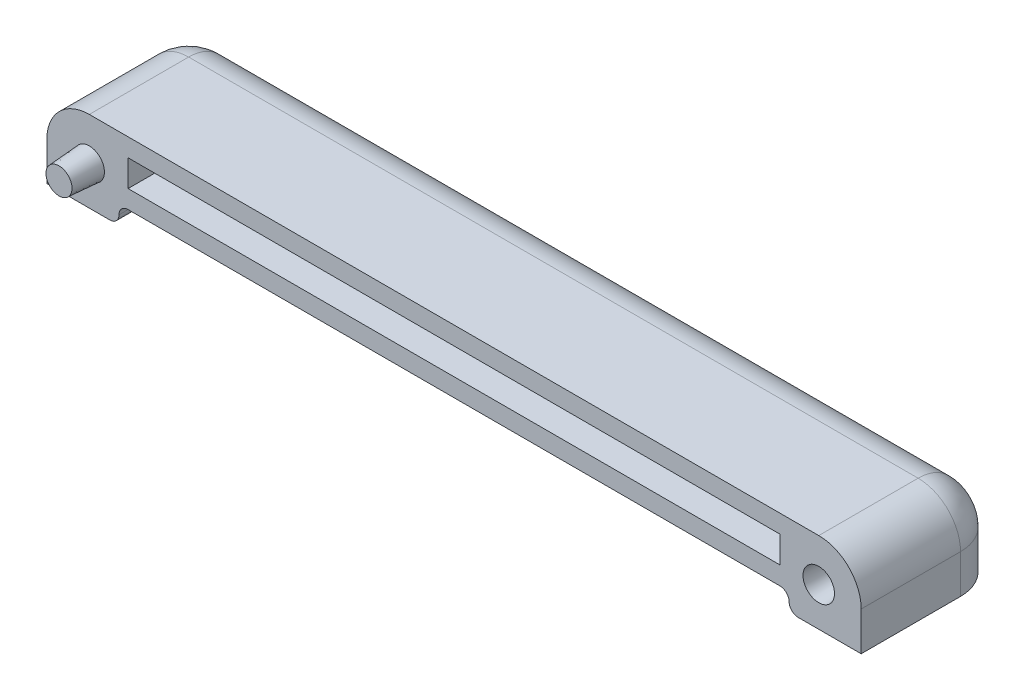
ISO-10303-21;
HEADER;
FILE_DESCRIPTION(('STEP AP214'),'2;1');
FILE_NAME('part.step','',(''),(''),'','','');
FILE_SCHEMA(('AUTOMOTIVE_DESIGN { 1 0 10303 214 1 1 1 1 }'));
ENDSEC;
DATA;
#1=APPLICATION_CONTEXT('core data for automotive mechanical design processes');
#2=APPLICATION_PROTOCOL_DEFINITION('international standard','automotive_design',2000,#1);
#3=PRODUCT_CONTEXT('',#1,'mechanical');
#4=PRODUCT('Part','Part','',(#3));
#5=PRODUCT_RELATED_PRODUCT_CATEGORY('part','',(#4));
#6=PRODUCT_DEFINITION_FORMATION('','',#4);
#7=PRODUCT_DEFINITION_CONTEXT('part definition',#1,'design');
#8=PRODUCT_DEFINITION('design','',#6,#7);
#9=PRODUCT_DEFINITION_SHAPE('','',#8);
#10=(LENGTH_UNIT() NAMED_UNIT(*) SI_UNIT(.MILLI.,.METRE.));
#11=(NAMED_UNIT(*) PLANE_ANGLE_UNIT() SI_UNIT($,.RADIAN.));
#12=(NAMED_UNIT(*) SI_UNIT($,.STERADIAN.) SOLID_ANGLE_UNIT());
#13=UNCERTAINTY_MEASURE_WITH_UNIT(LENGTH_MEASURE(1.E-05),#10,'distance_accuracy_value','');
#14=(GEOMETRIC_REPRESENTATION_CONTEXT(3) GLOBAL_UNCERTAINTY_ASSIGNED_CONTEXT((#13)) GLOBAL_UNIT_ASSIGNED_CONTEXT((#10,
#11,#12)) REPRESENTATION_CONTEXT('',''));
#15=CARTESIAN_POINT('',(0.,0.,0.));
#16=DIRECTION('',(0.,0.,1.));
#17=DIRECTION('',(1.,0.,0.));
#18=AXIS2_PLACEMENT_3D('',#15,#16,#17);
#19=CARTESIAN_POINT('',(0.,0.,3.));
#20=DIRECTION('',(0.,0.,-1.));
#21=DIRECTION('',(-1.,0.,0.));
#22=AXIS2_PLACEMENT_3D('',#19,#20,#21);
#23=PLANE('',#22);
#24=DIRECTION('',(1.,0.,0.));
#25=VECTOR('',#24,1.);
#26=CARTESIAN_POINT('',(67.2,-161.948648405154,3.));
#27=LINE('',#26,#25);
#28=CARTESIAN_POINT('',(-43.6000000000001,-161.948648405154,3.));
#29=VERTEX_POINT('',#28);
#30=CARTESIAN_POINT('',(43.6000000000001,-161.948648405154,3.));
#31=VERTEX_POINT('',#30);
#32=EDGE_CURVE('E309',#29,#31,#27,.T.);
#33=ORIENTED_EDGE('',*,*,#32,.F.);
#34=DIRECTION('',(0.,-1.,0.));
#35=VECTOR('',#34,1.);
#36=CARTESIAN_POINT('',(-43.6000000000001,-161.948648405154,3.));
#37=LINE('',#36,#35);
#38=CARTESIAN_POINT('',(-43.6000000000001,-171.948648405154,3.));
#39=VERTEX_POINT('',#38);
#40=EDGE_CURVE('E314',#29,#39,#37,.T.);
#41=ORIENTED_EDGE('',*,*,#40,.T.);
#42=DIRECTION('',(1.,0.,0.));
#43=VECTOR('',#42,1.);
#44=CARTESIAN_POINT('',(-43.6000000000001,-171.948648405154,3.));
#45=LINE('',#44,#43);
#46=CARTESIAN_POINT('',(43.6000000000001,-171.948648405154,3.));
#47=VERTEX_POINT('',#46);
#48=EDGE_CURVE('E316',#39,#47,#45,.T.);
#49=ORIENTED_EDGE('',*,*,#48,.T.);
#50=DIRECTION('',(0.,1.,0.));
#51=VECTOR('',#50,1.);
#52=CARTESIAN_POINT('',(43.6000000000001,-171.948648405154,3.));
#53=LINE('',#52,#51);
#54=EDGE_CURVE('E319',#47,#31,#53,.T.);
#55=ORIENTED_EDGE('',*,*,#54,.T.);
#56=EDGE_LOOP('',(#33,#41,#49,#55));
#57=FACE_BOUND('',#56,.T.);
#58=ADVANCED_FACE('F46',(#57),#23,.F.);
#59=CARTESIAN_POINT('',(-43.6000000000001,-161.948648405154,3.));
#60=DIRECTION('',(1.,0.,0.));
#61=DIRECTION('',(0.,0.,-1.));
#62=AXIS2_PLACEMENT_3D('',#59,#60,#61);
#63=PLANE('',#62);
#64=DIRECTION('',(0.,-1.,0.));
#65=VECTOR('',#64,1.);
#66=CARTESIAN_POINT('',(-43.6000000000001,-161.948648405154,0.));
#67=LINE('',#66,#65);
#68=CARTESIAN_POINT('',(-43.6000000000001,-161.948648405154,0.));
#69=VERTEX_POINT('',#68);
#70=CARTESIAN_POINT('',(-43.6000000000001,-171.948648405154,0.));
#71=VERTEX_POINT('',#70);
#72=EDGE_CURVE('E323',#69,#71,#67,.T.);
#73=ORIENTED_EDGE('',*,*,#72,.T.);
#74=DIRECTION('',(0.,0.,-1.));
#75=VECTOR('',#74,1.);
#76=CARTESIAN_POINT('',(-43.6000000000001,-171.948648405154,3.));
#77=LINE('',#76,#75);
#78=EDGE_CURVE('E342',#39,#71,#77,.T.);
#79=ORIENTED_EDGE('',*,*,#78,.F.);
#80=ORIENTED_EDGE('',*,*,#40,.F.);
#81=DIRECTION('',(0.,0.,-1.));
#82=VECTOR('',#81,1.);
#83=CARTESIAN_POINT('',(-43.6000000000001,-161.948648405154,3.));
#84=LINE('',#83,#82);
#85=EDGE_CURVE('E313',#29,#69,#84,.T.);
#86=ORIENTED_EDGE('',*,*,#85,.T.);
#87=EDGE_LOOP('',(#73,#79,#80,#86));
#88=FACE_BOUND('',#87,.T.);
#89=ADVANCED_FACE('F438',(#88),#63,.F.);
#90=CARTESIAN_POINT('',(-43.6000000000001,-171.948648405154,3.));
#91=DIRECTION('',(0.,1.,0.));
#92=DIRECTION('',(0.,0.,1.));
#93=AXIS2_PLACEMENT_3D('',#90,#91,#92);
#94=PLANE('',#93);
#95=DIRECTION('',(1.,0.,0.));
#96=VECTOR('',#95,1.);
#97=CARTESIAN_POINT('',(-43.6000000000001,-171.948648405154,0.));
#98=LINE('',#97,#96);
#99=CARTESIAN_POINT('',(43.6000000000001,-171.948648405154,0.));
#100=VERTEX_POINT('',#99);
#101=EDGE_CURVE('E325',#71,#100,#98,.T.);
#102=ORIENTED_EDGE('',*,*,#101,.T.);
#103=DIRECTION('',(0.,0.,-1.));
#104=VECTOR('',#103,1.);
#105=CARTESIAN_POINT('',(43.6000000000001,-171.948648405154,3.));
#106=LINE('',#105,#104);
#107=EDGE_CURVE('E339',#47,#100,#106,.T.);
#108=ORIENTED_EDGE('',*,*,#107,.F.);
#109=ORIENTED_EDGE('',*,*,#48,.F.);
#110=ORIENTED_EDGE('',*,*,#78,.T.);
#111=EDGE_LOOP('',(#102,#108,#109,#110));
#112=FACE_BOUND('',#111,.T.);
#113=ADVANCED_FACE('F444',(#112),#94,.F.);
#114=CARTESIAN_POINT('',(43.6000000000001,-171.948648405154,3.));
#115=DIRECTION('',(-1.,0.,0.));
#116=DIRECTION('',(0.,0.,1.));
#117=AXIS2_PLACEMENT_3D('',#114,#115,#116);
#118=PLANE('',#117);
#119=DIRECTION('',(0.,1.,0.));
#120=VECTOR('',#119,1.);
#121=CARTESIAN_POINT('',(43.6000000000001,-171.948648405154,0.));
#122=LINE('',#121,#120);
#123=CARTESIAN_POINT('',(43.6000000000001,-161.948648405154,0.));
#124=VERTEX_POINT('',#123);
#125=EDGE_CURVE('E327',#100,#124,#122,.T.);
#126=ORIENTED_EDGE('',*,*,#125,.T.);
#127=DIRECTION('',(0.,0.,-1.));
#128=VECTOR('',#127,1.);
#129=CARTESIAN_POINT('',(43.6000000000001,-161.948648405154,3.));
#130=LINE('',#129,#128);
#131=EDGE_CURVE('E336',#31,#124,#130,.T.);
#132=ORIENTED_EDGE('',*,*,#131,.F.);
#133=ORIENTED_EDGE('',*,*,#54,.F.);
#134=ORIENTED_EDGE('',*,*,#107,.T.);
#135=EDGE_LOOP('',(#126,#132,#133,#134));
#136=FACE_BOUND('',#135,.T.);
#137=ADVANCED_FACE('F471',(#136),#118,.F.);
#138=CARTESIAN_POINT('',(43.6000000000001,-161.948648405154,3.));
#139=DIRECTION('',(0.,1.,0.));
#140=DIRECTION('',(0.,0.,1.));
#141=AXIS2_PLACEMENT_3D('',#138,#139,#140);
#142=PLANE('',#141);
#143=CARTESIAN_POINT('',(-48.3000000000006,-161.948648405154,18.9));
#144=DIRECTION('',(0.,1.,0.));
#145=DIRECTION('',(0.,0.,1.));
#146=AXIS2_PLACEMENT_3D('',#143,#144,#145);
#147=CIRCLE('',#146,8.5);
#148=CARTESIAN_POINT('',(-48.3000000000006,-161.948648405154,10.4));
#149=VERTEX_POINT('',#148);
#150=CARTESIAN_POINT('',(-56.8000000000006,-161.948648405154,18.9));
#151=VERTEX_POINT('',#150);
#152=EDGE_CURVE('E394',#149,#151,#147,.T.);
#153=ORIENTED_EDGE('',*,*,#152,.T.);
#154=DIRECTION('',(0.,0.,-1.));
#155=VECTOR('',#154,1.);
#156=CARTESIAN_POINT('',(-56.8000000000006,-161.948648405154,3.));
#157=LINE('',#156,#155);
#158=CARTESIAN_POINT('',(-56.8000000000006,-161.948648405154,23.4));
#159=VERTEX_POINT('',#158);
#160=EDGE_CURVE('E396',#151,#159,#157,.F.);
#161=ORIENTED_EDGE('',*,*,#160,.T.);
#162=DIRECTION('',(1.,0.,0.));
#163=VECTOR('',#162,1.);
#164=CARTESIAN_POINT('',(-67.2,-161.948648405154,23.4));
#165=LINE('',#164,#163);
#166=CARTESIAN_POINT('',(-67.2,-161.948648405154,23.4));
#167=VERTEX_POINT('',#166);
#168=EDGE_CURVE('E305',#167,#159,#165,.T.);
#169=ORIENTED_EDGE('',*,*,#168,.F.);
#170=DIRECTION('',(0.,0.,-1.));
#171=VECTOR('',#170,1.);
#172=CARTESIAN_POINT('',(-67.2,-161.948648405154,3.));
#173=LINE('',#172,#171);
#174=CARTESIAN_POINT('',(-67.2,-161.948648405154,7.));
#175=VERTEX_POINT('',#174);
#176=EDGE_CURVE('E321',#167,#175,#173,.T.);
#177=ORIENTED_EDGE('',*,*,#176,.T.);
#178=CARTESIAN_POINT('',(-60.2,-161.948648405154,7.));
#179=DIRECTION('',(0.,1.,0.));
#180=DIRECTION('',(0.,0.,1.));
#181=AXIS2_PLACEMENT_3D('',#178,#179,#180);
#182=CIRCLE('',#181,7.);
#183=CARTESIAN_POINT('',(-60.2,-161.948648405154,0.));
#184=VERTEX_POINT('',#183);
#185=EDGE_CURVE('E363',#175,#184,#182,.F.);
#186=ORIENTED_EDGE('',*,*,#185,.T.);
#187=DIRECTION('',(1.,0.,0.));
#188=VECTOR('',#187,1.);
#189=CARTESIAN_POINT('',(-67.2,-161.948648405154,0.));
#190=LINE('',#189,#188);
#191=EDGE_CURVE('E308',#184,#69,#190,.T.);
#192=ORIENTED_EDGE('',*,*,#191,.T.);
#193=ORIENTED_EDGE('',*,*,#85,.F.);
#194=ORIENTED_EDGE('',*,*,#32,.T.);
#195=ORIENTED_EDGE('',*,*,#131,.T.);
#196=DIRECTION('',(1.,0.,0.));
#197=VECTOR('',#196,1.);
#198=CARTESIAN_POINT('',(43.6000000000001,-161.948648405154,0.));
#199=LINE('',#198,#197);
#200=CARTESIAN_POINT('',(60.2,-161.948648405154,0.));
#201=VERTEX_POINT('',#200);
#202=EDGE_CURVE('E317',#124,#201,#199,.T.);
#203=ORIENTED_EDGE('',*,*,#202,.T.);
#204=CARTESIAN_POINT('',(60.2,-161.948648405154,7.));
#205=DIRECTION('',(0.,1.,0.));
#206=DIRECTION('',(0.,0.,1.));
#207=AXIS2_PLACEMENT_3D('',#204,#205,#206);
#208=CIRCLE('',#207,7.);
#209=CARTESIAN_POINT('',(67.2,-161.948648405154,7.));
#210=VERTEX_POINT('',#209);
#211=EDGE_CURVE('E365',#201,#210,#208,.F.);
#212=ORIENTED_EDGE('',*,*,#211,.T.);
#213=DIRECTION('',(0.,0.,-1.));
#214=VECTOR('',#213,1.);
#215=CARTESIAN_POINT('',(67.2,-161.948648405154,3.));
#216=LINE('',#215,#214);
#217=CARTESIAN_POINT('',(67.2,-161.948648405154,23.4));
#218=VERTEX_POINT('',#217);
#219=EDGE_CURVE('E333',#218,#210,#216,.T.);
#220=ORIENTED_EDGE('',*,*,#219,.F.);
#221=CARTESIAN_POINT('',(56.8000000000006,-161.948648405154,23.4));
#222=VERTEX_POINT('',#221);
#223=EDGE_CURVE('E304',#222,#218,#165,.T.);
#224=ORIENTED_EDGE('',*,*,#223,.F.);
#225=DIRECTION('',(0.,0.,1.));
#226=VECTOR('',#225,1.);
#227=CARTESIAN_POINT('',(56.8000000000005,-161.948648405154,2.99999999999998));
#228=LINE('',#227,#226);
#229=CARTESIAN_POINT('',(56.8000000000006,-161.948648405154,18.9));
#230=VERTEX_POINT('',#229);
#231=EDGE_CURVE('E392',#222,#230,#228,.F.);
#232=ORIENTED_EDGE('',*,*,#231,.T.);
#233=CARTESIAN_POINT('',(48.3000000000006,-161.948648405154,18.9));
#234=DIRECTION('',(0.,1.,0.));
#235=DIRECTION('',(0.,0.,1.));
#236=AXIS2_PLACEMENT_3D('',#233,#234,#235);
#237=CIRCLE('',#236,8.5);
#238=CARTESIAN_POINT('',(48.3000000000006,-161.948648405154,10.4));
#239=VERTEX_POINT('',#238);
#240=EDGE_CURVE('E390',#230,#239,#237,.T.);
#241=ORIENTED_EDGE('',*,*,#240,.T.);
#242=DIRECTION('',(1.,0.,0.));
#243=VECTOR('',#242,1.);
#244=CARTESIAN_POINT('',(43.6000000000001,-161.948648405154,10.4));
#245=LINE('',#244,#243);
#246=EDGE_CURVE('E374',#239,#149,#245,.F.);
#247=ORIENTED_EDGE('',*,*,#246,.T.);
#248=EDGE_LOOP('',(#153,#161,#169,#177,#186,#192,#193,#194,#195,#203,#212,#220,#224,#232,#241,#247));
#249=FACE_BOUND('',#248,.T.);
#250=ADVANCED_FACE('F467',(#249),#142,.F.);
#251=CARTESIAN_POINT('',(67.2,-161.948648405154,3.));
#252=DIRECTION('',(-1.,0.,0.));
#253=DIRECTION('',(0.,-1.,0.));
#254=AXIS2_PLACEMENT_3D('',#251,#252,#253);
#255=PLANE('',#254);
#256=ORIENTED_EDGE('',*,*,#219,.T.);
#257=DIRECTION('',(0.,1.,0.));
#258=VECTOR('',#257,1.);
#259=CARTESIAN_POINT('',(67.2,-148.548648405155,7.));
#260=LINE('',#259,#258);
#261=CARTESIAN_POINT('',(67.2,-155.548648405154,7.));
#262=VERTEX_POINT('',#261);
#263=EDGE_CURVE('E361',#210,#262,#260,.T.);
#264=ORIENTED_EDGE('',*,*,#263,.T.);
#265=DIRECTION('',(0.,0.,-1.));
#266=VECTOR('',#265,1.);
#267=CARTESIAN_POINT('',(67.2,-155.548648405154,3.));
#268=LINE('',#267,#266);
#269=CARTESIAN_POINT('',(67.2,-155.548648405154,23.4));
#270=VERTEX_POINT('',#269);
#271=EDGE_CURVE('E359',#262,#270,#268,.F.);
#272=ORIENTED_EDGE('',*,*,#271,.T.);
#273=DIRECTION('',(0.,1.,0.));
#274=VECTOR('',#273,1.);
#275=CARTESIAN_POINT('',(67.2,-161.948648405154,23.4));
#276=LINE('',#275,#274);
#277=EDGE_CURVE('E296',#218,#270,#276,.T.);
#278=ORIENTED_EDGE('',*,*,#277,.F.);
#279=EDGE_LOOP('',(#256,#264,#272,#278));
#280=FACE_BOUND('',#279,.T.);
#281=ADVANCED_FACE('F463',(#280),#255,.F.);
#282=CARTESIAN_POINT('',(67.2,-148.548648405155,3.));
#283=DIRECTION('',(0.,-1.,0.));
#284=DIRECTION('',(1.,0.,0.));
#285=AXIS2_PLACEMENT_3D('',#282,#283,#284);
#286=PLANE('',#285);
#287=DIRECTION('',(-1.,0.,0.));
#288=VECTOR('',#287,1.);
#289=CARTESIAN_POINT('',(67.2,-148.548648405155,23.4));
#290=LINE('',#289,#288);
#291=CARTESIAN_POINT('',(60.2,-148.548648405155,23.4));
#292=VERTEX_POINT('',#291);
#293=CARTESIAN_POINT('',(-60.2,-148.548648405155,23.4));
#294=VERTEX_POINT('',#293);
#295=EDGE_CURVE('E299',#292,#294,#290,.T.);
#296=ORIENTED_EDGE('',*,*,#295,.F.);
#297=DIRECTION('',(0.,0.,-1.));
#298=VECTOR('',#297,1.);
#299=CARTESIAN_POINT('',(60.2,-148.548648405155,3.));
#300=LINE('',#299,#298);
#301=CARTESIAN_POINT('',(60.2,-148.548648405155,7.));
#302=VERTEX_POINT('',#301);
#303=EDGE_CURVE('E351',#292,#302,#300,.T.);
#304=ORIENTED_EDGE('',*,*,#303,.T.);
#305=DIRECTION('',(-1.,0.,0.));
#306=VECTOR('',#305,1.);
#307=CARTESIAN_POINT('',(-67.2,-148.548648405155,7.));
#308=LINE('',#307,#306);
#309=CARTESIAN_POINT('',(-60.2,-148.548648405155,7.));
#310=VERTEX_POINT('',#309);
#311=EDGE_CURVE('E348',#302,#310,#308,.T.);
#312=ORIENTED_EDGE('',*,*,#311,.T.);
#313=DIRECTION('',(0.,0.,-1.));
#314=VECTOR('',#313,1.);
#315=CARTESIAN_POINT('',(-60.2,-148.548648405155,3.));
#316=LINE('',#315,#314);
#317=EDGE_CURVE('E312',#310,#294,#316,.F.);
#318=ORIENTED_EDGE('',*,*,#317,.T.);
#319=EDGE_LOOP('',(#296,#304,#312,#318));
#320=FACE_BOUND('',#319,.T.);
#321=ADVANCED_FACE('F459',(#320),#286,.F.);
#322=CARTESIAN_POINT('',(-67.2,-148.548648405155,3.));
#323=DIRECTION('',(1.,0.,0.));
#324=DIRECTION('',(0.,1.,0.));
#325=AXIS2_PLACEMENT_3D('',#322,#323,#324);
#326=PLANE('',#325);
#327=DIRECTION('',(0.,0.,-1.));
#328=VECTOR('',#327,1.);
#329=CARTESIAN_POINT('',(-67.2,-155.548648405155,3.));
#330=LINE('',#329,#328);
#331=CARTESIAN_POINT('',(-67.2,-155.548648405155,23.4));
#332=VERTEX_POINT('',#331);
#333=CARTESIAN_POINT('',(-67.2,-155.548648405155,7.));
#334=VERTEX_POINT('',#333);
#335=EDGE_CURVE('E371',#332,#334,#330,.T.);
#336=ORIENTED_EDGE('',*,*,#335,.T.);
#337=DIRECTION('',(0.,-1.,0.));
#338=VECTOR('',#337,1.);
#339=CARTESIAN_POINT('',(-67.2,-161.948648405154,7.));
#340=LINE('',#339,#338);
#341=EDGE_CURVE('E373',#334,#175,#340,.T.);
#342=ORIENTED_EDGE('',*,*,#341,.T.);
#343=ORIENTED_EDGE('',*,*,#176,.F.);
#344=DIRECTION('',(0.,-1.,0.));
#345=VECTOR('',#344,1.);
#346=CARTESIAN_POINT('',(-67.2,-148.548648405155,23.4));
#347=LINE('',#346,#345);
#348=EDGE_CURVE('E302',#332,#167,#347,.T.);
#349=ORIENTED_EDGE('',*,*,#348,.F.);
#350=EDGE_LOOP('',(#336,#342,#343,#349));
#351=FACE_BOUND('',#350,.T.);
#352=ADVANCED_FACE('F455',(#351),#326,.F.);
#353=CARTESIAN_POINT('',(0.,0.,0.));
#354=DIRECTION('',(0.,0.,-1.));
#355=DIRECTION('',(-1.,0.,0.));
#356=AXIS2_PLACEMENT_3D('',#353,#354,#355);
#357=PLANE('',#356);
#358=DIRECTION('',(-1.,0.,0.));
#359=VECTOR('',#358,1.);
#360=CARTESIAN_POINT('',(67.2,-155.548648405155,0.));
#361=LINE('',#360,#359);
#362=CARTESIAN_POINT('',(-60.2,-155.548648405155,0.));
#363=VERTEX_POINT('',#362);
#364=CARTESIAN_POINT('',(60.2,-155.548648405155,0.));
#365=VERTEX_POINT('',#364);
#366=EDGE_CURVE('E355',#363,#365,#361,.F.);
#367=ORIENTED_EDGE('',*,*,#366,.T.);
#368=DIRECTION('',(0.,1.,0.));
#369=VECTOR('',#368,1.);
#370=CARTESIAN_POINT('',(60.2,-161.948648405154,0.));
#371=LINE('',#370,#369);
#372=EDGE_CURVE('E357',#365,#201,#371,.F.);
#373=ORIENTED_EDGE('',*,*,#372,.T.);
#374=ORIENTED_EDGE('',*,*,#202,.F.);
#375=ORIENTED_EDGE('',*,*,#125,.F.);
#376=ORIENTED_EDGE('',*,*,#101,.F.);
#377=ORIENTED_EDGE('',*,*,#72,.F.);
#378=ORIENTED_EDGE('',*,*,#191,.F.);
#379=DIRECTION('',(0.,-1.,0.));
#380=VECTOR('',#379,1.);
#381=CARTESIAN_POINT('',(-60.2,-148.548648405155,0.));
#382=LINE('',#381,#380);
#383=EDGE_CURVE('E353',#184,#363,#382,.F.);
#384=ORIENTED_EDGE('',*,*,#383,.T.);
#385=EDGE_LOOP('',(#367,#373,#374,#375,#376,#377,#378,#384));
#386=FACE_BOUND('',#385,.T.);
#387=ADVANCED_FACE('F451',(#386),#357,.T.);
#388=CARTESIAN_POINT('',(0.,0.,23.4));
#389=DIRECTION('',(0.,0.,1.));
#390=DIRECTION('',(1.,0.,0.));
#391=AXIS2_PLACEMENT_3D('',#388,#389,#390);
#392=PLANE('',#391);
#393=CARTESIAN_POINT('',(60.2,-155.548648405155,23.4));
#394=DIRECTION('',(0.,0.,1.));
#395=DIRECTION('',(1.,0.,0.));
#396=AXIS2_PLACEMENT_3D('',#393,#394,#395);
#397=CIRCLE('',#396,2.59999999999999);
#398=CARTESIAN_POINT('',(62.8,-155.548648405155,23.4));
#399=VERTEX_POINT('',#398);
#400=EDGE_CURVE('E822',#399,#399,#397,.T.);
#401=ORIENTED_EDGE('',*,*,#400,.F.);
#402=EDGE_LOOP('',(#401));
#403=FACE_BOUND('',#402,.T.);
#404=CARTESIAN_POINT('',(-60.2,-155.548648405155,23.4));
#405=DIRECTION('',(0.,0.,1.));
#406=DIRECTION('',(1.,0.,0.));
#407=AXIS2_PLACEMENT_3D('',#404,#405,#406);
#408=CIRCLE('',#407,2.5);
#409=CARTESIAN_POINT('',(-57.7,-155.548648405155,23.4));
#410=VERTEX_POINT('',#409);
#411=EDGE_CURVE('E13',#410,#410,#408,.T.);
#412=ORIENTED_EDGE('',*,*,#411,.F.);
#413=EDGE_LOOP('',(#412));
#414=FACE_BOUND('',#413,.T.);
#415=ORIENTED_EDGE('',*,*,#168,.T.);
#416=CARTESIAN_POINT('',(-56.8000000000006,-160.448648405154,23.4));
#417=DIRECTION('',(0.,0.,1.));
#418=DIRECTION('',(1.,0.,0.));
#419=AXIS2_PLACEMENT_3D('',#416,#417,#418);
#420=CIRCLE('',#419,1.5);
#421=CARTESIAN_POINT('',(-55.3000000000006,-160.448648405154,23.4));
#422=VERTEX_POINT('',#421);
#423=EDGE_CURVE('E401',#159,#422,#420,.T.);
#424=ORIENTED_EDGE('',*,*,#423,.T.);
#425=CARTESIAN_POINT('',(-53.8000000000006,-160.448648405154,23.4));
#426=DIRECTION('',(0.,0.,1.));
#427=DIRECTION('',(1.,0.,0.));
#428=AXIS2_PLACEMENT_3D('',#425,#426,#427);
#429=CIRCLE('',#428,1.5);
#430=CARTESIAN_POINT('',(-53.8000000000006,-158.948648405154,23.4));
#431=VERTEX_POINT('',#430);
#432=EDGE_CURVE('E56',#422,#431,#429,.F.);
#433=ORIENTED_EDGE('',*,*,#432,.T.);
#434=DIRECTION('',(-1.,0.,0.));
#435=VECTOR('',#434,1.);
#436=CARTESIAN_POINT('',(-55.3000000000006,-158.948648405154,23.4));
#437=LINE('',#436,#435);
#438=CARTESIAN_POINT('',(53.8000000000006,-158.948648405154,23.4));
#439=VERTEX_POINT('',#438);
#440=EDGE_CURVE('E257',#439,#431,#437,.T.);
#441=ORIENTED_EDGE('',*,*,#440,.F.);
#442=CARTESIAN_POINT('',(53.8000000000006,-160.448648405154,23.4));
#443=DIRECTION('',(0.,0.,1.));
#444=DIRECTION('',(1.,0.,0.));
#445=AXIS2_PLACEMENT_3D('',#442,#443,#444);
#446=CIRCLE('',#445,1.5);
#447=CARTESIAN_POINT('',(55.3000000000006,-160.448648405154,23.4));
#448=VERTEX_POINT('',#447);
#449=EDGE_CURVE('E407',#439,#448,#446,.F.);
#450=ORIENTED_EDGE('',*,*,#449,.T.);
#451=CARTESIAN_POINT('',(56.8000000000006,-160.448648405154,23.4));
#452=DIRECTION('',(0.,0.,1.));
#453=DIRECTION('',(1.,0.,0.));
#454=AXIS2_PLACEMENT_3D('',#451,#452,#453);
#455=CIRCLE('',#454,1.5);
#456=EDGE_CURVE('E399',#448,#222,#455,.T.);
#457=ORIENTED_EDGE('',*,*,#456,.T.);
#458=ORIENTED_EDGE('',*,*,#223,.T.);
#459=ORIENTED_EDGE('',*,*,#277,.T.);
#460=CARTESIAN_POINT('',(60.2,-155.548648405155,23.4));
#461=DIRECTION('',(0.,0.,1.));
#462=DIRECTION('',(1.,0.,0.));
#463=AXIS2_PLACEMENT_3D('',#460,#461,#462);
#464=CIRCLE('',#463,7.);
#465=EDGE_CURVE('E369',#270,#292,#464,.T.);
#466=ORIENTED_EDGE('',*,*,#465,.T.);
#467=ORIENTED_EDGE('',*,*,#295,.T.);
#468=CARTESIAN_POINT('',(-60.2,-155.548648405155,23.4));
#469=DIRECTION('',(0.,0.,1.));
#470=DIRECTION('',(1.,0.,0.));
#471=AXIS2_PLACEMENT_3D('',#468,#469,#470);
#472=CIRCLE('',#471,7.);
#473=EDGE_CURVE('E367',#294,#332,#472,.T.);
#474=ORIENTED_EDGE('',*,*,#473,.T.);
#475=ORIENTED_EDGE('',*,*,#348,.T.);
#476=EDGE_LOOP('',(#415,#424,#433,#441,#450,#457,#458,#459,#466,#467,#474,#475));
#477=FACE_BOUND('',#476,.T.);
#478=DIRECTION('',(-1.,0.,0.));
#479=VECTOR('',#478,1.);
#480=CARTESIAN_POINT('',(-53.8,-151.548648405154,23.4));
#481=LINE('',#480,#479);
#482=CARTESIAN_POINT('',(53.8,-151.548648405154,23.4));
#483=VERTEX_POINT('',#482);
#484=CARTESIAN_POINT('',(-53.8,-151.548648405154,23.4));
#485=VERTEX_POINT('',#484);
#486=EDGE_CURVE('E268',#483,#485,#481,.T.);
#487=ORIENTED_EDGE('',*,*,#486,.F.);
#488=DIRECTION('',(0.,1.,0.));
#489=VECTOR('',#488,1.);
#490=CARTESIAN_POINT('',(53.7999999999999,-155.948648405154,23.4));
#491=LINE('',#490,#489);
#492=CARTESIAN_POINT('',(53.7999999999999,-155.948648405154,23.4));
#493=VERTEX_POINT('',#492);
#494=EDGE_CURVE('E266',#493,#483,#491,.T.);
#495=ORIENTED_EDGE('',*,*,#494,.F.);
#496=DIRECTION('',(1.,0.,0.));
#497=VECTOR('',#496,1.);
#498=CARTESIAN_POINT('',(53.7999999999999,-155.948648405154,23.4));
#499=LINE('',#498,#497);
#500=CARTESIAN_POINT('',(-53.8,-155.948648405154,23.4));
#501=VERTEX_POINT('',#500);
#502=EDGE_CURVE('E275',#501,#493,#499,.T.);
#503=ORIENTED_EDGE('',*,*,#502,.F.);
#504=DIRECTION('',(0.,-1.,0.));
#505=VECTOR('',#504,1.);
#506=CARTESIAN_POINT('',(-53.8,-155.948648405154,23.4));
#507=LINE('',#506,#505);
#508=EDGE_CURVE('E272',#485,#501,#507,.T.);
#509=ORIENTED_EDGE('',*,*,#508,.F.);
#510=EDGE_LOOP('',(#487,#495,#503,#509));
#511=FACE_BOUND('',#510,.T.);
#512=ADVANCED_FACE('F454',(#403,#414,#477,#511),#392,.T.);
#513=CARTESIAN_POINT('',(53.7999999999999,-155.948648405154,23.4));
#514=DIRECTION('',(-1.,0.,0.));
#515=DIRECTION('',(0.,-1.,0.));
#516=AXIS2_PLACEMENT_3D('',#513,#514,#515);
#517=PLANE('',#516);
#518=DIRECTION('',(0.,1.,0.));
#519=VECTOR('',#518,1.);
#520=CARTESIAN_POINT('',(53.7999999999999,-155.948648405154,10.4));
#521=LINE('',#520,#519);
#522=CARTESIAN_POINT('',(53.7999999999999,-155.948648405154,10.4));
#523=VERTEX_POINT('',#522);
#524=CARTESIAN_POINT('',(53.8,-151.548648405154,10.4));
#525=VERTEX_POINT('',#524);
#526=EDGE_CURVE('E279',#523,#525,#521,.T.);
#527=ORIENTED_EDGE('',*,*,#526,.F.);
#528=DIRECTION('',(0.,0.,-1.));
#529=VECTOR('',#528,1.);
#530=CARTESIAN_POINT('',(53.7999999999999,-155.948648405154,23.4));
#531=LINE('',#530,#529);
#532=EDGE_CURVE('E278',#493,#523,#531,.T.);
#533=ORIENTED_EDGE('',*,*,#532,.F.);
#534=ORIENTED_EDGE('',*,*,#494,.T.);
#535=DIRECTION('',(0.,0.,-1.));
#536=VECTOR('',#535,1.);
#537=CARTESIAN_POINT('',(53.8,-151.548648405154,23.4));
#538=LINE('',#537,#536);
#539=EDGE_CURVE('E293',#483,#525,#538,.T.);
#540=ORIENTED_EDGE('',*,*,#539,.T.);
#541=EDGE_LOOP('',(#527,#533,#534,#540));
#542=FACE_BOUND('',#541,.T.);
#543=ADVANCED_FACE('F694',(#542),#517,.T.);
#544=CARTESIAN_POINT('',(-53.8,-151.548648405154,23.4));
#545=DIRECTION('',(0.,-1.,0.));
#546=DIRECTION('',(1.,0.,0.));
#547=AXIS2_PLACEMENT_3D('',#544,#545,#546);
#548=PLANE('',#547);
#549=DIRECTION('',(-1.,0.,0.));
#550=VECTOR('',#549,1.);
#551=CARTESIAN_POINT('',(-53.8,-151.548648405154,10.4));
#552=LINE('',#551,#550);
#553=CARTESIAN_POINT('',(-53.8,-151.548648405154,10.4));
#554=VERTEX_POINT('',#553);
#555=EDGE_CURVE('E281',#525,#554,#552,.T.);
#556=ORIENTED_EDGE('',*,*,#555,.F.);
#557=ORIENTED_EDGE('',*,*,#539,.F.);
#558=ORIENTED_EDGE('',*,*,#486,.T.);
#559=DIRECTION('',(0.,0.,-1.));
#560=VECTOR('',#559,1.);
#561=CARTESIAN_POINT('',(-53.8,-151.548648405154,23.4));
#562=LINE('',#561,#560);
#563=EDGE_CURVE('E290',#485,#554,#562,.T.);
#564=ORIENTED_EDGE('',*,*,#563,.T.);
#565=EDGE_LOOP('',(#556,#557,#558,#564));
#566=FACE_BOUND('',#565,.T.);
#567=ADVANCED_FACE('F685',(#566),#548,.T.);
#568=CARTESIAN_POINT('',(-53.8,-155.948648405154,23.4));
#569=DIRECTION('',(1.,0.,0.));
#570=DIRECTION('',(0.,0.,-1.));
#571=AXIS2_PLACEMENT_3D('',#568,#569,#570);
#572=PLANE('',#571);
#573=DIRECTION('',(0.,-1.,0.));
#574=VECTOR('',#573,1.);
#575=CARTESIAN_POINT('',(-53.8,-155.948648405154,10.4));
#576=LINE('',#575,#574);
#577=CARTESIAN_POINT('',(-53.8,-155.948648405154,10.4));
#578=VERTEX_POINT('',#577);
#579=EDGE_CURVE('E96',#554,#578,#576,.T.);
#580=ORIENTED_EDGE('',*,*,#579,.F.);
#581=ORIENTED_EDGE('',*,*,#563,.F.);
#582=ORIENTED_EDGE('',*,*,#508,.T.);
#583=DIRECTION('',(0.,0.,-1.));
#584=VECTOR('',#583,1.);
#585=CARTESIAN_POINT('',(-53.8,-155.948648405154,23.4));
#586=LINE('',#585,#584);
#587=EDGE_CURVE('E288',#501,#578,#586,.T.);
#588=ORIENTED_EDGE('',*,*,#587,.T.);
#589=EDGE_LOOP('',(#580,#581,#582,#588));
#590=FACE_BOUND('',#589,.T.);
#591=ADVANCED_FACE('F675',(#590),#572,.T.);
#592=CARTESIAN_POINT('',(53.7999999999999,-155.948648405154,23.4));
#593=DIRECTION('',(0.,1.,0.));
#594=DIRECTION('',(-1.,0.,0.));
#595=AXIS2_PLACEMENT_3D('',#592,#593,#594);
#596=PLANE('',#595);
#597=DIRECTION('',(1.,0.,0.));
#598=VECTOR('',#597,1.);
#599=CARTESIAN_POINT('',(53.7999999999999,-155.948648405154,10.4));
#600=LINE('',#599,#598);
#601=EDGE_CURVE('E269',#578,#523,#600,.T.);
#602=ORIENTED_EDGE('',*,*,#601,.F.);
#603=ORIENTED_EDGE('',*,*,#587,.F.);
#604=ORIENTED_EDGE('',*,*,#502,.T.);
#605=ORIENTED_EDGE('',*,*,#532,.T.);
#606=EDGE_LOOP('',(#602,#603,#604,#605));
#607=FACE_BOUND('',#606,.T.);
#608=ADVANCED_FACE('F669',(#607),#596,.T.);
#609=CARTESIAN_POINT('',(0.,0.,10.4));
#610=DIRECTION('',(0.,0.,1.));
#611=DIRECTION('',(1.,0.,0.));
#612=AXIS2_PLACEMENT_3D('',#609,#610,#611);
#613=PLANE('',#612);
#614=ORIENTED_EDGE('',*,*,#526,.T.);
#615=ORIENTED_EDGE('',*,*,#555,.T.);
#616=ORIENTED_EDGE('',*,*,#579,.T.);
#617=ORIENTED_EDGE('',*,*,#601,.T.);
#618=EDGE_LOOP('',(#614,#615,#616,#617));
#619=FACE_BOUND('',#618,.T.);
#620=ADVANCED_FACE('F449',(#619),#613,.T.);
#621=CARTESIAN_POINT('',(60.2,-161.948648405154,7.));
#622=DIRECTION('',(0.,-1.,0.));
#623=DIRECTION('',(1.,0.,0.));
#624=AXIS2_PLACEMENT_3D('',#621,#622,#623);
#625=CYLINDRICAL_SURFACE('',#624,7.);
#626=ORIENTED_EDGE('',*,*,#211,.F.);
#627=ORIENTED_EDGE('',*,*,#372,.F.);
#628=CARTESIAN_POINT('',(60.2,-155.548648405155,7.));
#629=DIRECTION('',(0.,1.,0.));
#630=DIRECTION('',(-1.,0.,0.));
#631=AXIS2_PLACEMENT_3D('',#628,#629,#630);
#632=CIRCLE('',#631,7.);
#633=EDGE_CURVE('E282',#262,#365,#632,.T.);
#634=ORIENTED_EDGE('',*,*,#633,.F.);
#635=ORIENTED_EDGE('',*,*,#263,.F.);
#636=EDGE_LOOP('',(#626,#627,#634,#635));
#637=FACE_BOUND('',#636,.T.);
#638=ADVANCED_FACE('F502',(#637),#625,.T.);
#639=CARTESIAN_POINT('',(60.2,-155.548648405155,3.));
#640=DIRECTION('',(0.,0.,-1.));
#641=DIRECTION('',(-1.,0.,0.));
#642=AXIS2_PLACEMENT_3D('',#639,#640,#641);
#643=CYLINDRICAL_SURFACE('',#642,7.);
#644=ORIENTED_EDGE('',*,*,#465,.F.);
#645=ORIENTED_EDGE('',*,*,#271,.F.);
#646=CARTESIAN_POINT('',(60.2,-155.548648405155,7.));
#647=DIRECTION('',(0.,0.,-1.));
#648=DIRECTION('',(-1.,0.,0.));
#649=AXIS2_PLACEMENT_3D('',#646,#647,#648);
#650=CIRCLE('',#649,7.);
#651=EDGE_CURVE('E384',#302,#262,#650,.T.);
#652=ORIENTED_EDGE('',*,*,#651,.F.);
#653=ORIENTED_EDGE('',*,*,#303,.F.);
#654=EDGE_LOOP('',(#644,#645,#652,#653));
#655=FACE_BOUND('',#654,.T.);
#656=ADVANCED_FACE('F498',(#655),#643,.T.);
#657=CARTESIAN_POINT('',(-60.2,-155.548648405155,3.));
#658=DIRECTION('',(0.,0.,-1.));
#659=DIRECTION('',(-1.,0.,0.));
#660=AXIS2_PLACEMENT_3D('',#657,#658,#659);
#661=CYLINDRICAL_SURFACE('',#660,7.);
#662=ORIENTED_EDGE('',*,*,#473,.F.);
#663=ORIENTED_EDGE('',*,*,#317,.F.);
#664=CARTESIAN_POINT('',(-60.2,-155.548648405155,7.));
#665=DIRECTION('',(0.,0.,-1.));
#666=DIRECTION('',(-1.,0.,0.));
#667=AXIS2_PLACEMENT_3D('',#664,#665,#666);
#668=CIRCLE('',#667,7.);
#669=EDGE_CURVE('E381',#334,#310,#668,.T.);
#670=ORIENTED_EDGE('',*,*,#669,.F.);
#671=ORIENTED_EDGE('',*,*,#335,.F.);
#672=EDGE_LOOP('',(#662,#663,#670,#671));
#673=FACE_BOUND('',#672,.T.);
#674=ADVANCED_FACE('F494',(#673),#661,.T.);
#675=CARTESIAN_POINT('',(-60.2,-148.548648405155,7.));
#676=DIRECTION('',(0.,1.,0.));
#677=DIRECTION('',(-1.,0.,0.));
#678=AXIS2_PLACEMENT_3D('',#675,#676,#677);
#679=CYLINDRICAL_SURFACE('',#678,7.);
#680=ORIENTED_EDGE('',*,*,#185,.F.);
#681=ORIENTED_EDGE('',*,*,#341,.F.);
#682=CARTESIAN_POINT('',(-60.2,-155.548648405155,7.));
#683=DIRECTION('',(0.,1.,0.));
#684=DIRECTION('',(-1.,0.,0.));
#685=AXIS2_PLACEMENT_3D('',#682,#683,#684);
#686=CIRCLE('',#685,7.);
#687=EDGE_CURVE('E378',#363,#334,#686,.T.);
#688=ORIENTED_EDGE('',*,*,#687,.F.);
#689=ORIENTED_EDGE('',*,*,#383,.F.);
#690=EDGE_LOOP('',(#680,#681,#688,#689));
#691=FACE_BOUND('',#690,.T.);
#692=ADVANCED_FACE('F490',(#691),#679,.T.);
#693=CARTESIAN_POINT('',(60.2,-155.548648405155,7.));
#694=DIRECTION('',(0.,0.,1.));
#695=DIRECTION('',(1.,0.,0.));
#696=AXIS2_PLACEMENT_3D('',#693,#694,#695);
#697=SPHERICAL_SURFACE('',#696,7.);
#698=ORIENTED_EDGE('',*,*,#651,.T.);
#699=ORIENTED_EDGE('',*,*,#633,.T.);
#700=CARTESIAN_POINT('',(60.2,-155.548648405155,7.));
#701=DIRECTION('',(1.,0.,0.));
#702=DIRECTION('',(0.,0.,-1.));
#703=AXIS2_PLACEMENT_3D('',#700,#701,#702);
#704=CIRCLE('',#703,7.);
#705=EDGE_CURVE('E261',#302,#365,#704,.F.);
#706=ORIENTED_EDGE('',*,*,#705,.F.);
#707=EDGE_LOOP('',(#698,#699,#706));
#708=FACE_BOUND('',#707,.T.);
#709=ADVANCED_FACE('F486',(#708),#697,.T.);
#710=CARTESIAN_POINT('',(-60.2,-155.548648405155,7.));
#711=DIRECTION('',(0.,0.,1.));
#712=DIRECTION('',(1.,0.,0.));
#713=AXIS2_PLACEMENT_3D('',#710,#711,#712);
#714=SPHERICAL_SURFACE('',#713,7.);
#715=ORIENTED_EDGE('',*,*,#687,.T.);
#716=ORIENTED_EDGE('',*,*,#669,.T.);
#717=CARTESIAN_POINT('',(-60.2,-155.548648405155,7.));
#718=DIRECTION('',(-1.,0.,0.));
#719=DIRECTION('',(0.,0.,1.));
#720=AXIS2_PLACEMENT_3D('',#717,#718,#719);
#721=CIRCLE('',#720,7.);
#722=EDGE_CURVE('E258',#363,#310,#721,.F.);
#723=ORIENTED_EDGE('',*,*,#722,.F.);
#724=EDGE_LOOP('',(#715,#716,#723));
#725=FACE_BOUND('',#724,.T.);
#726=ADVANCED_FACE('F482',(#725),#714,.T.);
#727=CARTESIAN_POINT('',(67.2,-155.548648405155,7.));
#728=DIRECTION('',(1.,0.,0.));
#729=DIRECTION('',(0.,1.,0.));
#730=AXIS2_PLACEMENT_3D('',#727,#728,#729);
#731=CYLINDRICAL_SURFACE('',#730,7.);
#732=ORIENTED_EDGE('',*,*,#705,.T.);
#733=ORIENTED_EDGE('',*,*,#366,.F.);
#734=ORIENTED_EDGE('',*,*,#722,.T.);
#735=ORIENTED_EDGE('',*,*,#311,.F.);
#736=EDGE_LOOP('',(#732,#733,#734,#735));
#737=FACE_BOUND('',#736,.T.);
#738=ADVANCED_FACE('F479',(#737),#731,.T.);
#739=CARTESIAN_POINT('',(48.3000000000006,-158.948648405154,18.9));
#740=DIRECTION('',(0.,-1.,0.));
#741=DIRECTION('',(0.,0.,-1.));
#742=AXIS2_PLACEMENT_3D('',#739,#740,#741);
#743=PLANE('',#742);
#744=CARTESIAN_POINT('',(48.3000000000006,-158.948648405154,18.9));
#745=DIRECTION('',(0.,-1.,0.));
#746=DIRECTION('',(0.,0.,-1.));
#747=AXIS2_PLACEMENT_3D('',#744,#745,#746);
#748=CIRCLE('',#747,5.5);
#749=CARTESIAN_POINT('',(48.3000000000006,-158.948648405154,13.4));
#750=VERTEX_POINT('',#749);
#751=CARTESIAN_POINT('',(53.8000000000006,-158.948648405154,18.9));
#752=VERTEX_POINT('',#751);
#753=EDGE_CURVE('E65',#750,#752,#748,.T.);
#754=ORIENTED_EDGE('',*,*,#753,.T.);
#755=DIRECTION('',(0.,0.,1.));
#756=VECTOR('',#755,1.);
#757=CARTESIAN_POINT('',(53.8000000000006,-158.948648405154,18.9));
#758=LINE('',#757,#756);
#759=EDGE_CURVE('E405',#752,#439,#758,.T.);
#760=ORIENTED_EDGE('',*,*,#759,.T.);
#761=ORIENTED_EDGE('',*,*,#440,.T.);
#762=DIRECTION('',(0.,0.,-1.));
#763=VECTOR('',#762,1.);
#764=CARTESIAN_POINT('',(-53.8000000000006,-158.948648405154,18.9));
#765=LINE('',#764,#763);
#766=CARTESIAN_POINT('',(-53.8000000000006,-158.948648405154,18.9));
#767=VERTEX_POINT('',#766);
#768=EDGE_CURVE('E226',#431,#767,#765,.T.);
#769=ORIENTED_EDGE('',*,*,#768,.T.);
#770=CARTESIAN_POINT('',(-48.3000000000006,-158.948648405154,18.9));
#771=DIRECTION('',(0.,-1.,0.));
#772=DIRECTION('',(0.,0.,-1.));
#773=AXIS2_PLACEMENT_3D('',#770,#771,#772);
#774=CIRCLE('',#773,5.5);
#775=CARTESIAN_POINT('',(-48.3000000000006,-158.948648405154,13.4));
#776=VERTEX_POINT('',#775);
#777=EDGE_CURVE('E220',#767,#776,#774,.T.);
#778=ORIENTED_EDGE('',*,*,#777,.T.);
#779=DIRECTION('',(1.,0.,0.));
#780=VECTOR('',#779,1.);
#781=CARTESIAN_POINT('',(48.3000000000006,-158.948648405154,13.4));
#782=LINE('',#781,#780);
#783=EDGE_CURVE('E223',#776,#750,#782,.T.);
#784=ORIENTED_EDGE('',*,*,#783,.T.);
#785=EDGE_LOOP('',(#754,#760,#761,#769,#778,#784));
#786=FACE_BOUND('',#785,.T.);
#787=ADVANCED_FACE('F222',(#786),#743,.T.);
#788=CARTESIAN_POINT('',(53.8000000000006,-160.448648405154,18.9));
#789=DIRECTION('',(0.,0.,1.));
#790=DIRECTION('',(1.,0.,0.));
#791=AXIS2_PLACEMENT_3D('',#788,#789,#790);
#792=CYLINDRICAL_SURFACE('',#791,1.5);
#793=ORIENTED_EDGE('',*,*,#449,.F.);
#794=ORIENTED_EDGE('',*,*,#759,.F.);
#795=CARTESIAN_POINT('',(53.8000000000006,-160.448648405154,18.9));
#796=DIRECTION('',(0.,0.,1.));
#797=DIRECTION('',(1.,0.,0.));
#798=AXIS2_PLACEMENT_3D('',#795,#796,#797);
#799=CIRCLE('',#798,1.5);
#800=CARTESIAN_POINT('',(55.3000000000006,-160.448648405154,18.9));
#801=VERTEX_POINT('',#800);
#802=EDGE_CURVE('E50',#801,#752,#799,.T.);
#803=ORIENTED_EDGE('',*,*,#802,.F.);
#804=DIRECTION('',(0.,0.,1.));
#805=VECTOR('',#804,1.);
#806=CARTESIAN_POINT('',(55.3000000000006,-160.448648405154,18.9));
#807=LINE('',#806,#805);
#808=EDGE_CURVE('E253',#448,#801,#807,.F.);
#809=ORIENTED_EDGE('',*,*,#808,.F.);
#810=EDGE_LOOP('',(#793,#794,#803,#809));
#811=FACE_BOUND('',#810,.T.);
#812=ADVANCED_FACE('F48',(#811),#792,.F.);
#813=CARTESIAN_POINT('',(48.3000000000006,-160.448648405154,18.9));
#814=DIRECTION('',(0.,-1.,0.));
#815=DIRECTION('',(0.,0.,-1.));
#816=AXIS2_PLACEMENT_3D('',#813,#814,#815);
#817=TOROIDAL_SURFACE('',#816,5.5,1.5);
#818=ORIENTED_EDGE('',*,*,#802,.T.);
#819=ORIENTED_EDGE('',*,*,#753,.F.);
#820=CARTESIAN_POINT('',(48.3000000000006,-160.448648405154,13.4));
#821=DIRECTION('',(1.,0.,0.));
#822=DIRECTION('',(0.,0.,-1.));
#823=AXIS2_PLACEMENT_3D('',#820,#821,#822);
#824=CIRCLE('',#823,1.5);
#825=CARTESIAN_POINT('',(48.3000000000006,-160.448648405154,11.9));
#826=VERTEX_POINT('',#825);
#827=EDGE_CURVE('E81',#826,#750,#824,.T.);
#828=ORIENTED_EDGE('',*,*,#827,.F.);
#829=CARTESIAN_POINT('',(48.3000000000006,-160.448648405154,18.9));
#830=DIRECTION('',(0.,-1.,0.));
#831=DIRECTION('',(0.,0.,-1.));
#832=AXIS2_PLACEMENT_3D('',#829,#830,#831);
#833=CIRCLE('',#832,7.);
#834=EDGE_CURVE('E246',#801,#826,#833,.F.);
#835=ORIENTED_EDGE('',*,*,#834,.F.);
#836=EDGE_LOOP('',(#818,#819,#828,#835));
#837=FACE_BOUND('',#836,.T.);
#838=ADVANCED_FACE('F429',(#837),#817,.F.);
#839=CARTESIAN_POINT('',(56.8000000000006,-160.448648405154,18.9));
#840=DIRECTION('',(0.,0.,1.));
#841=DIRECTION('',(1.,0.,0.));
#842=AXIS2_PLACEMENT_3D('',#839,#840,#841);
#843=CYLINDRICAL_SURFACE('',#842,1.5);
#844=ORIENTED_EDGE('',*,*,#456,.F.);
#845=ORIENTED_EDGE('',*,*,#808,.T.);
#846=CARTESIAN_POINT('',(56.8000000000006,-160.448648405154,18.9));
#847=DIRECTION('',(0.,0.,-1.));
#848=DIRECTION('',(-1.,0.,0.));
#849=AXIS2_PLACEMENT_3D('',#846,#847,#848);
#850=CIRCLE('',#849,1.5);
#851=EDGE_CURVE('E242',#230,#801,#850,.T.);
#852=ORIENTED_EDGE('',*,*,#851,.F.);
#853=ORIENTED_EDGE('',*,*,#231,.F.);
#854=EDGE_LOOP('',(#844,#845,#852,#853));
#855=FACE_BOUND('',#854,.T.);
#856=ADVANCED_FACE('F431',(#855),#843,.T.);
#857=CARTESIAN_POINT('',(48.3000000000006,-160.448648405154,13.4));
#858=DIRECTION('',(1.,0.,0.));
#859=DIRECTION('',(0.,0.,-1.));
#860=AXIS2_PLACEMENT_3D('',#857,#858,#859);
#861=CYLINDRICAL_SURFACE('',#860,1.5);
#862=ORIENTED_EDGE('',*,*,#827,.T.);
#863=ORIENTED_EDGE('',*,*,#783,.F.);
#864=CARTESIAN_POINT('',(-48.3000000000006,-160.448648405154,13.4));
#865=DIRECTION('',(1.,0.,0.));
#866=DIRECTION('',(0.,0.,-1.));
#867=AXIS2_PLACEMENT_3D('',#864,#865,#866);
#868=CIRCLE('',#867,1.5);
#869=CARTESIAN_POINT('',(-48.3000000000006,-160.448648405154,11.9));
#870=VERTEX_POINT('',#869);
#871=EDGE_CURVE('E234',#870,#776,#868,.T.);
#872=ORIENTED_EDGE('',*,*,#871,.F.);
#873=DIRECTION('',(1.,0.,0.));
#874=VECTOR('',#873,1.);
#875=CARTESIAN_POINT('',(-48.3000000000006,-160.448648405154,11.9));
#876=LINE('',#875,#874);
#877=EDGE_CURVE('E243',#826,#870,#876,.F.);
#878=ORIENTED_EDGE('',*,*,#877,.F.);
#879=EDGE_LOOP('',(#862,#863,#872,#878));
#880=FACE_BOUND('',#879,.T.);
#881=ADVANCED_FACE('F232',(#880),#861,.F.);
#882=CARTESIAN_POINT('',(48.3000000000006,-160.448648405154,18.9));
#883=DIRECTION('',(0.,1.,0.));
#884=DIRECTION('',(0.,0.,1.));
#885=AXIS2_PLACEMENT_3D('',#882,#883,#884);
#886=TOROIDAL_SURFACE('',#885,8.5,1.5);
#887=ORIENTED_EDGE('',*,*,#851,.T.);
#888=ORIENTED_EDGE('',*,*,#834,.T.);
#889=CARTESIAN_POINT('',(48.3000000000006,-160.448648405154,10.4));
#890=DIRECTION('',(-1.,0.,0.));
#891=DIRECTION('',(0.,0.,1.));
#892=AXIS2_PLACEMENT_3D('',#889,#890,#891);
#893=CIRCLE('',#892,1.5);
#894=EDGE_CURVE('E248',#239,#826,#893,.T.);
#895=ORIENTED_EDGE('',*,*,#894,.F.);
#896=ORIENTED_EDGE('',*,*,#240,.F.);
#897=EDGE_LOOP('',(#887,#888,#895,#896));
#898=FACE_BOUND('',#897,.T.);
#899=ADVANCED_FACE('F428',(#898),#886,.T.);
#900=CARTESIAN_POINT('',(-48.3000000000006,-160.448648405154,18.9));
#901=DIRECTION('',(0.,-1.,0.));
#902=DIRECTION('',(0.,0.,-1.));
#903=AXIS2_PLACEMENT_3D('',#900,#901,#902);
#904=TOROIDAL_SURFACE('',#903,5.5,1.5);
#905=ORIENTED_EDGE('',*,*,#871,.T.);
#906=ORIENTED_EDGE('',*,*,#777,.F.);
#907=CARTESIAN_POINT('',(-53.8000000000006,-160.448648405154,18.9));
#908=DIRECTION('',(0.,0.,-1.));
#909=DIRECTION('',(-1.,0.,0.));
#910=AXIS2_PLACEMENT_3D('',#907,#908,#909);
#911=CIRCLE('',#910,1.5);
#912=CARTESIAN_POINT('',(-55.3000000000006,-160.448648405154,18.9));
#913=VERTEX_POINT('',#912);
#914=EDGE_CURVE('E419',#913,#767,#911,.T.);
#915=ORIENTED_EDGE('',*,*,#914,.F.);
#916=CARTESIAN_POINT('',(-48.3000000000006,-160.448648405154,18.9));
#917=DIRECTION('',(0.,-1.,0.));
#918=DIRECTION('',(0.,0.,-1.));
#919=AXIS2_PLACEMENT_3D('',#916,#917,#918);
#920=CIRCLE('',#919,7.);
#921=EDGE_CURVE('E240',#870,#913,#920,.F.);
#922=ORIENTED_EDGE('',*,*,#921,.F.);
#923=EDGE_LOOP('',(#905,#906,#915,#922));
#924=FACE_BOUND('',#923,.T.);
#925=ADVANCED_FACE('F238',(#924),#904,.F.);
#926=CARTESIAN_POINT('',(-48.3000000000006,-160.448648405154,10.4));
#927=DIRECTION('',(1.,0.,0.));
#928=DIRECTION('',(0.,0.,-1.));
#929=AXIS2_PLACEMENT_3D('',#926,#927,#928);
#930=CYLINDRICAL_SURFACE('',#929,1.5);
#931=ORIENTED_EDGE('',*,*,#894,.T.);
#932=ORIENTED_EDGE('',*,*,#877,.T.);
#933=CARTESIAN_POINT('',(-48.3000000000006,-160.448648405154,10.4));
#934=DIRECTION('',(-1.,0.,0.));
#935=DIRECTION('',(0.,0.,1.));
#936=AXIS2_PLACEMENT_3D('',#933,#934,#935);
#937=CIRCLE('',#936,1.5);
#938=EDGE_CURVE('E416',#149,#870,#937,.T.);
#939=ORIENTED_EDGE('',*,*,#938,.F.);
#940=ORIENTED_EDGE('',*,*,#246,.F.);
#941=EDGE_LOOP('',(#931,#932,#939,#940));
#942=FACE_BOUND('',#941,.T.);
#943=ADVANCED_FACE('F424',(#942),#930,.T.);
#944=CARTESIAN_POINT('',(-53.8000000000006,-160.448648405154,18.9));
#945=DIRECTION('',(0.,0.,-1.));
#946=DIRECTION('',(-1.,0.,0.));
#947=AXIS2_PLACEMENT_3D('',#944,#945,#946);
#948=CYLINDRICAL_SURFACE('',#947,1.5);
#949=ORIENTED_EDGE('',*,*,#768,.F.);
#950=ORIENTED_EDGE('',*,*,#432,.F.);
#951=DIRECTION('',(0.,0.,-1.));
#952=VECTOR('',#951,1.);
#953=CARTESIAN_POINT('',(-55.3000000000006,-160.448648405154,23.4));
#954=LINE('',#953,#952);
#955=EDGE_CURVE('E413',#913,#422,#954,.F.);
#956=ORIENTED_EDGE('',*,*,#955,.F.);
#957=ORIENTED_EDGE('',*,*,#914,.T.);
#958=EDGE_LOOP('',(#949,#950,#956,#957));
#959=FACE_BOUND('',#958,.T.);
#960=ADVANCED_FACE('F515',(#959),#948,.F.);
#961=CARTESIAN_POINT('',(-48.3000000000006,-160.448648405154,18.9));
#962=DIRECTION('',(0.,1.,0.));
#963=DIRECTION('',(0.,0.,1.));
#964=AXIS2_PLACEMENT_3D('',#961,#962,#963);
#965=TOROIDAL_SURFACE('',#964,8.5,1.5);
#966=ORIENTED_EDGE('',*,*,#938,.T.);
#967=ORIENTED_EDGE('',*,*,#921,.T.);
#968=CARTESIAN_POINT('',(-56.8000000000006,-160.448648405154,18.9));
#969=DIRECTION('',(0.,0.,1.));
#970=DIRECTION('',(1.,0.,0.));
#971=AXIS2_PLACEMENT_3D('',#968,#969,#970);
#972=CIRCLE('',#971,1.5);
#973=EDGE_CURVE('E410',#151,#913,#972,.T.);
#974=ORIENTED_EDGE('',*,*,#973,.F.);
#975=ORIENTED_EDGE('',*,*,#152,.F.);
#976=EDGE_LOOP('',(#966,#967,#974,#975));
#977=FACE_BOUND('',#976,.T.);
#978=ADVANCED_FACE('F511',(#977),#965,.T.);
#979=CARTESIAN_POINT('',(-56.8000000000006,-160.448648405154,23.4));
#980=DIRECTION('',(0.,0.,-1.));
#981=DIRECTION('',(-1.,0.,0.));
#982=AXIS2_PLACEMENT_3D('',#979,#980,#981);
#983=CYLINDRICAL_SURFACE('',#982,1.5);
#984=ORIENTED_EDGE('',*,*,#423,.F.);
#985=ORIENTED_EDGE('',*,*,#160,.F.);
#986=ORIENTED_EDGE('',*,*,#973,.T.);
#987=ORIENTED_EDGE('',*,*,#955,.T.);
#988=EDGE_LOOP('',(#984,#985,#986,#987));
#989=FACE_BOUND('',#988,.T.);
#990=ADVANCED_FACE('F507',(#989),#983,.T.);
#991=CARTESIAN_POINT('',(-60.2,-155.548648405155,23.4));
#992=DIRECTION('',(0.,0.,-1.));
#993=DIRECTION('',(1.,0.,0.));
#994=AXIS2_PLACEMENT_3D('',#991,#992,#993);
#995=CONICAL_SURFACE('',#994,2.5,0.0698131700797733);
#996=CARTESIAN_POINT('',(-60.2,-155.548648405155,28.4));
#997=DIRECTION('',(0.,0.,1.));
#998=DIRECTION('',(1.,0.,0.));
#999=AXIS2_PLACEMENT_3D('',#996,#997,#998);
#1000=CIRCLE('',#999,2.15036594028245);
#1001=CARTESIAN_POINT('',(-58.0496340597176,-155.548648405155,28.4));
#1002=VERTEX_POINT('',#1001);
#1003=EDGE_CURVE('E265',#1002,#1002,#1000,.T.);
#1004=ORIENTED_EDGE('',*,*,#1003,.F.);
#1005=EDGE_LOOP('',(#1004));
#1006=FACE_BOUND('',#1005,.T.);
#1007=ORIENTED_EDGE('',*,*,#411,.T.);
#1008=EDGE_LOOP('',(#1007));
#1009=FACE_BOUND('',#1008,.T.);
#1010=ADVANCED_FACE('F510',(#1006,#1009),#995,.T.);
#1011=CARTESIAN_POINT('',(-60.2,-155.548648405155,28.4));
#1012=DIRECTION('',(0.,0.,1.));
#1013=DIRECTION('',(1.,0.,0.));
#1014=AXIS2_PLACEMENT_3D('',#1011,#1012,#1013);
#1015=PLANE('',#1014);
#1016=ORIENTED_EDGE('',*,*,#1003,.T.);
#1017=EDGE_LOOP('',(#1016));
#1018=FACE_BOUND('',#1017,.T.);
#1019=ADVANCED_FACE('F561',(#1018),#1015,.T.);
#1020=CARTESIAN_POINT('',(60.2,-155.548648405155,23.4));
#1021=DIRECTION('',(0.,0.,1.));
#1022=DIRECTION('',(1.,0.,0.));
#1023=AXIS2_PLACEMENT_3D('',#1020,#1021,#1022);
#1024=CONICAL_SURFACE('',#1023,2.59999999999999,0.0663225115757847);
#1025=CARTESIAN_POINT('',(60.2,-155.548648405155,18.2));
#1026=DIRECTION('',(0.,0.,1.));
#1027=DIRECTION('',(1.,0.,0.));
#1028=AXIS2_PLACEMENT_3D('',#1025,#1026,#1027);
#1029=CIRCLE('',#1028,2.25461638108239);
#1030=CARTESIAN_POINT('',(62.4546163810824,-155.548648405155,18.2));
#1031=VERTEX_POINT('',#1030);
#1032=EDGE_CURVE('E873',#1031,#1031,#1029,.T.);
#1033=ORIENTED_EDGE('',*,*,#1032,.F.);
#1034=EDGE_LOOP('',(#1033));
#1035=FACE_BOUND('',#1034,.T.);
#1036=ORIENTED_EDGE('',*,*,#400,.T.);
#1037=EDGE_LOOP('',(#1036));
#1038=FACE_BOUND('',#1037,.T.);
#1039=ADVANCED_FACE('F569',(#1035,#1038),#1024,.F.);
#1040=CARTESIAN_POINT('',(60.2,-155.548648405155,18.2));
#1041=DIRECTION('',(0.,0.,1.));
#1042=DIRECTION('',(1.,0.,0.));
#1043=AXIS2_PLACEMENT_3D('',#1040,#1041,#1042);
#1044=PLANE('',#1043);
#1045=ORIENTED_EDGE('',*,*,#1032,.T.);
#1046=EDGE_LOOP('',(#1045));
#1047=FACE_BOUND('',#1046,.T.);
#1048=ADVANCED_FACE('F578',(#1047),#1044,.T.);
#1049=CLOSED_SHELL('',(#58,#89,#113,#137,#250,#281,#321,#352,#387,#512,#543,#567,#591,#608,#620,
#638,#656,#674,#692,#709,#726,#738,#787,#812,#838,#856,#881,#899,#925,#943,#960,#978,#990,#1010,
#1019,#1039,#1048));
#1050=MANIFOLD_SOLID_BREP('B2',#1049);
#1051=ADVANCED_BREP_SHAPE_REPRESENTATION('',(#18,#1050),#14);
#1052=SHAPE_DEFINITION_REPRESENTATION(#9,#1051);
ENDSEC;
END-ISO-10303-21;
